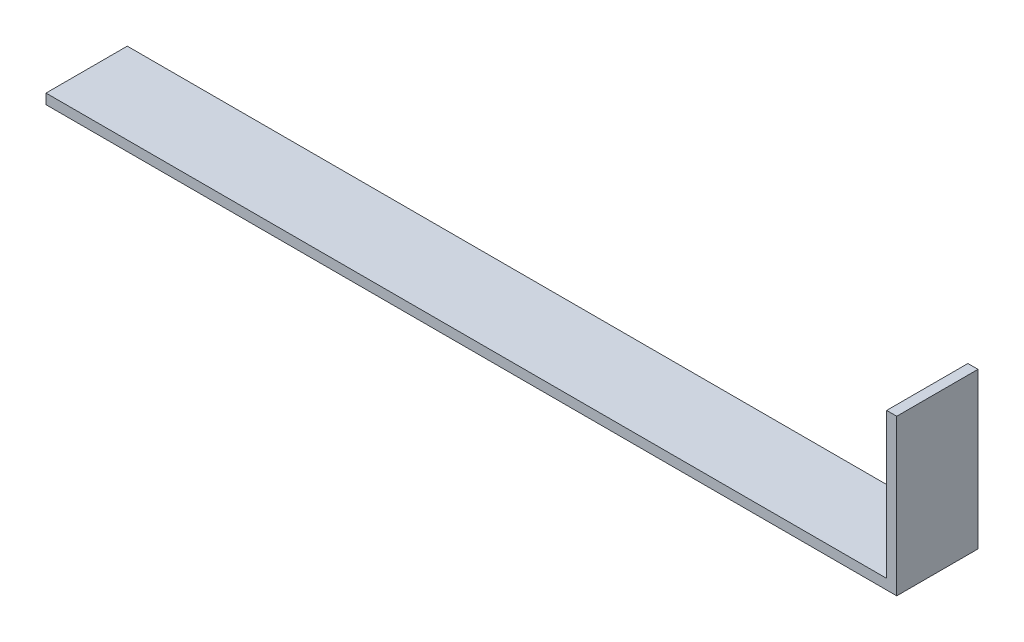
ISO-10303-21;
HEADER;
FILE_DESCRIPTION(('STEP AP214'),'2;1');
FILE_NAME('part.step','',(''),(''),'','','');
FILE_SCHEMA(('AUTOMOTIVE_DESIGN { 1 0 10303 214 1 1 1 1 }'));
ENDSEC;
DATA;
#1=APPLICATION_CONTEXT('core data for automotive mechanical design processes');
#2=APPLICATION_PROTOCOL_DEFINITION('international standard','automotive_design',2000,#1);
#3=PRODUCT_CONTEXT('',#1,'mechanical');
#4=PRODUCT('Part','Part','',(#3));
#5=PRODUCT_RELATED_PRODUCT_CATEGORY('part','',(#4));
#6=PRODUCT_DEFINITION_FORMATION('','',#4);
#7=PRODUCT_DEFINITION_CONTEXT('part definition',#1,'design');
#8=PRODUCT_DEFINITION('design','',#6,#7);
#9=PRODUCT_DEFINITION_SHAPE('','',#8);
#10=(LENGTH_UNIT() NAMED_UNIT(*) SI_UNIT(.MILLI.,.METRE.));
#11=(NAMED_UNIT(*) PLANE_ANGLE_UNIT() SI_UNIT($,.RADIAN.));
#12=(NAMED_UNIT(*) SI_UNIT($,.STERADIAN.) SOLID_ANGLE_UNIT());
#13=UNCERTAINTY_MEASURE_WITH_UNIT(LENGTH_MEASURE(1.E-05),#10,'distance_accuracy_value','');
#14=(GEOMETRIC_REPRESENTATION_CONTEXT(3) GLOBAL_UNCERTAINTY_ASSIGNED_CONTEXT((#13)) GLOBAL_UNIT_ASSIGNED_CONTEXT((#10,
#11,#12)) REPRESENTATION_CONTEXT('',''));
#15=CARTESIAN_POINT('',(0.,0.,0.));
#16=DIRECTION('',(0.,0.,1.));
#17=DIRECTION('',(1.,0.,0.));
#18=AXIS2_PLACEMENT_3D('',#15,#16,#17);
#19=CARTESIAN_POINT('',(0.,-6.31,50.8));
#20=DIRECTION('',(0.,1.,0.));
#21=DIRECTION('',(0.,0.,1.));
#22=AXIS2_PLACEMENT_3D('',#19,#20,#21);
#23=PLANE('',#22);
#24=DIRECTION('',(1.,0.,0.));
#25=VECTOR('',#24,1.);
#26=CARTESIAN_POINT('',(0.,-6.31,0.));
#27=LINE('',#26,#25);
#28=CARTESIAN_POINT('',(-322.45,-6.31,0.));
#29=VERTEX_POINT('',#28);
#30=CARTESIAN_POINT('',(209.247647511231,-6.31,0.));
#31=VERTEX_POINT('',#30);
#32=EDGE_CURVE('E96',#29,#31,#27,.T.);
#33=ORIENTED_EDGE('',*,*,#32,.T.);
#34=DIRECTION('',(0.,0.,-1.));
#35=VECTOR('',#34,1.);
#36=CARTESIAN_POINT('',(209.247647511231,-6.31,50.8));
#37=LINE('',#36,#35);
#38=CARTESIAN_POINT('',(209.247647511231,-6.31,50.8));
#39=VERTEX_POINT('',#38);
#40=EDGE_CURVE('E11',#39,#31,#37,.T.);
#41=ORIENTED_EDGE('',*,*,#40,.F.);
#42=DIRECTION('',(1.,0.,0.));
#43=VECTOR('',#42,1.);
#44=CARTESIAN_POINT('',(0.,-6.31,50.8));
#45=LINE('',#44,#43);
#46=CARTESIAN_POINT('',(-322.45,-6.31,50.8));
#47=VERTEX_POINT('',#46);
#48=EDGE_CURVE('E77',#47,#39,#45,.T.);
#49=ORIENTED_EDGE('',*,*,#48,.F.);
#50=DIRECTION('',(0.,0.,1.));
#51=VECTOR('',#50,1.);
#52=CARTESIAN_POINT('',(-322.45,-6.31,50.8));
#53=LINE('',#52,#51);
#54=EDGE_CURVE('E107',#29,#47,#53,.T.);
#55=ORIENTED_EDGE('',*,*,#54,.F.);
#56=EDGE_LOOP('',(#33,#41,#49,#55));
#57=FACE_BOUND('',#56,.T.);
#58=ADVANCED_FACE('F35',(#57),#23,.F.);
#59=CARTESIAN_POINT('',(209.247647511231,-6.31,50.8));
#60=DIRECTION('',(-1.,0.,0.));
#61=DIRECTION('',(0.,0.,1.));
#62=AXIS2_PLACEMENT_3D('',#59,#60,#61);
#63=PLANE('',#62);
#64=DIRECTION('',(0.,1.,0.));
#65=VECTOR('',#64,1.);
#66=CARTESIAN_POINT('',(209.247647511231,-6.31,0.));
#67=LINE('',#66,#65);
#68=CARTESIAN_POINT('',(209.247647511231,90.92,0.));
#69=VERTEX_POINT('',#68);
#70=EDGE_CURVE('E102',#31,#69,#67,.T.);
#71=ORIENTED_EDGE('',*,*,#70,.T.);
#72=DIRECTION('',(0.,0.,-1.));
#73=VECTOR('',#72,1.);
#74=CARTESIAN_POINT('',(209.247647511231,90.92,0.));
#75=LINE('',#74,#73);
#76=CARTESIAN_POINT('',(209.247647511231,90.92,50.8));
#77=VERTEX_POINT('',#76);
#78=EDGE_CURVE('E104',#77,#69,#75,.T.);
#79=ORIENTED_EDGE('',*,*,#78,.F.);
#80=DIRECTION('',(0.,1.,0.));
#81=VECTOR('',#80,1.);
#82=CARTESIAN_POINT('',(209.247647511231,-6.31,50.8));
#83=LINE('',#82,#81);
#84=EDGE_CURVE('E122',#39,#77,#83,.T.);
#85=ORIENTED_EDGE('',*,*,#84,.F.);
#86=ORIENTED_EDGE('',*,*,#40,.T.);
#87=EDGE_LOOP('',(#71,#79,#85,#86));
#88=FACE_BOUND('',#87,.T.);
#89=ADVANCED_FACE('F153',(#88),#63,.F.);
#90=CARTESIAN_POINT('',(202.93764751123,90.92,50.8));
#91=DIRECTION('',(0.,-1.,0.));
#92=DIRECTION('',(0.,0.,-1.));
#93=AXIS2_PLACEMENT_3D('',#90,#91,#92);
#94=PLANE('',#93);
#95=DIRECTION('',(-1.,0.,0.));
#96=VECTOR('',#95,1.);
#97=CARTESIAN_POINT('',(202.93764751123,90.92,50.8));
#98=LINE('',#97,#96);
#99=CARTESIAN_POINT('',(202.93764751123,90.92,50.8));
#100=VERTEX_POINT('',#99);
#101=EDGE_CURVE('E125',#77,#100,#98,.T.);
#102=ORIENTED_EDGE('',*,*,#101,.F.);
#103=ORIENTED_EDGE('',*,*,#78,.T.);
#104=DIRECTION('',(-1.,0.,0.));
#105=VECTOR('',#104,1.);
#106=CARTESIAN_POINT('',(202.93764751123,90.92,0.));
#107=LINE('',#106,#105);
#108=CARTESIAN_POINT('',(202.93764751123,90.92,0.));
#109=VERTEX_POINT('',#108);
#110=EDGE_CURVE('E66',#69,#109,#107,.T.);
#111=ORIENTED_EDGE('',*,*,#110,.T.);
#112=DIRECTION('',(0.,0.,-1.));
#113=VECTOR('',#112,1.);
#114=CARTESIAN_POINT('',(202.93764751123,90.92,50.8));
#115=LINE('',#114,#113);
#116=EDGE_CURVE('E43',#100,#109,#115,.T.);
#117=ORIENTED_EDGE('',*,*,#116,.F.);
#118=EDGE_LOOP('',(#102,#103,#111,#117));
#119=FACE_BOUND('',#118,.T.);
#120=ADVANCED_FACE('F157',(#119),#94,.F.);
#121=CARTESIAN_POINT('',(202.93764751123,0.,50.8));
#122=DIRECTION('',(1.,0.,0.));
#123=DIRECTION('',(0.,0.,-1.));
#124=AXIS2_PLACEMENT_3D('',#121,#122,#123);
#125=PLANE('',#124);
#126=DIRECTION('',(0.,-1.,0.));
#127=VECTOR('',#126,1.);
#128=CARTESIAN_POINT('',(202.93764751123,0.,0.));
#129=LINE('',#128,#127);
#130=CARTESIAN_POINT('',(202.93764751123,0.,0.));
#131=VERTEX_POINT('',#130);
#132=EDGE_CURVE('E71',#109,#131,#129,.T.);
#133=ORIENTED_EDGE('',*,*,#132,.T.);
#134=DIRECTION('',(0.,0.,-1.));
#135=VECTOR('',#134,1.);
#136=CARTESIAN_POINT('',(202.93764751123,0.,50.8));
#137=LINE('',#136,#135);
#138=CARTESIAN_POINT('',(202.93764751123,0.,50.8));
#139=VERTEX_POINT('',#138);
#140=EDGE_CURVE('E129',#139,#131,#137,.T.);
#141=ORIENTED_EDGE('',*,*,#140,.F.);
#142=DIRECTION('',(0.,-1.,0.));
#143=VECTOR('',#142,1.);
#144=CARTESIAN_POINT('',(202.93764751123,0.,50.8));
#145=LINE('',#144,#143);
#146=EDGE_CURVE('E51',#100,#139,#145,.T.);
#147=ORIENTED_EDGE('',*,*,#146,.F.);
#148=ORIENTED_EDGE('',*,*,#116,.T.);
#149=EDGE_LOOP('',(#133,#141,#147,#148));
#150=FACE_BOUND('',#149,.T.);
#151=ADVANCED_FACE('F135',(#150),#125,.F.);
#152=CARTESIAN_POINT('',(0.,0.,50.8));
#153=DIRECTION('',(0.,-1.,0.));
#154=DIRECTION('',(0.,0.,-1.));
#155=AXIS2_PLACEMENT_3D('',#152,#153,#154);
#156=PLANE('',#155);
#157=DIRECTION('',(-1.,0.,0.));
#158=VECTOR('',#157,1.);
#159=CARTESIAN_POINT('',(0.,0.,0.));
#160=LINE('',#159,#158);
#161=CARTESIAN_POINT('',(-322.45,0.,0.));
#162=VERTEX_POINT('',#161);
#163=EDGE_CURVE('E123',#131,#162,#160,.T.);
#164=ORIENTED_EDGE('',*,*,#163,.T.);
#165=DIRECTION('',(0.,0.,-1.));
#166=VECTOR('',#165,1.);
#167=CARTESIAN_POINT('',(-322.45,0.,0.));
#168=LINE('',#167,#166);
#169=CARTESIAN_POINT('',(-322.45,0.,50.8));
#170=VERTEX_POINT('',#169);
#171=EDGE_CURVE('E115',#170,#162,#168,.T.);
#172=ORIENTED_EDGE('',*,*,#171,.F.);
#173=DIRECTION('',(-1.,0.,0.));
#174=VECTOR('',#173,1.);
#175=CARTESIAN_POINT('',(0.,0.,50.8));
#176=LINE('',#175,#174);
#177=EDGE_CURVE('E128',#139,#170,#176,.T.);
#178=ORIENTED_EDGE('',*,*,#177,.F.);
#179=ORIENTED_EDGE('',*,*,#140,.T.);
#180=EDGE_LOOP('',(#164,#172,#178,#179));
#181=FACE_BOUND('',#180,.T.);
#182=ADVANCED_FACE('F138',(#181),#156,.F.);
#183=CARTESIAN_POINT('',(0.,0.,50.8));
#184=DIRECTION('',(0.,0.,1.));
#185=DIRECTION('',(1.,0.,0.));
#186=AXIS2_PLACEMENT_3D('',#183,#184,#185);
#187=PLANE('',#186);
#188=ORIENTED_EDGE('',*,*,#84,.T.);
#189=ORIENTED_EDGE('',*,*,#101,.T.);
#190=ORIENTED_EDGE('',*,*,#146,.T.);
#191=ORIENTED_EDGE('',*,*,#177,.T.);
#192=DIRECTION('',(0.,1.,0.));
#193=VECTOR('',#192,1.);
#194=CARTESIAN_POINT('',(-322.45,0.,50.8));
#195=LINE('',#194,#193);
#196=EDGE_CURVE('E110',#47,#170,#195,.T.);
#197=ORIENTED_EDGE('',*,*,#196,.F.);
#198=ORIENTED_EDGE('',*,*,#48,.T.);
#199=EDGE_LOOP('',(#188,#189,#190,#191,#197,#198));
#200=FACE_BOUND('',#199,.T.);
#201=ADVANCED_FACE('F140',(#200),#187,.T.);
#202=CARTESIAN_POINT('',(0.,0.,0.));
#203=DIRECTION('',(0.,0.,1.));
#204=DIRECTION('',(1.,0.,0.));
#205=AXIS2_PLACEMENT_3D('',#202,#203,#204);
#206=PLANE('',#205);
#207=ORIENTED_EDGE('',*,*,#110,.F.);
#208=ORIENTED_EDGE('',*,*,#70,.F.);
#209=ORIENTED_EDGE('',*,*,#32,.F.);
#210=DIRECTION('',(0.,-1.,0.));
#211=VECTOR('',#210,1.);
#212=CARTESIAN_POINT('',(-322.45,-6.31,0.));
#213=LINE('',#212,#211);
#214=EDGE_CURVE('E101',#162,#29,#213,.T.);
#215=ORIENTED_EDGE('',*,*,#214,.F.);
#216=ORIENTED_EDGE('',*,*,#163,.F.);
#217=ORIENTED_EDGE('',*,*,#132,.F.);
#218=EDGE_LOOP('',(#207,#208,#209,#215,#216,#217));
#219=FACE_BOUND('',#218,.T.);
#220=ADVANCED_FACE('F98',(#219),#206,.F.);
#221=CARTESIAN_POINT('',(-322.45,0.,0.));
#222=DIRECTION('',(1.,0.,0.));
#223=DIRECTION('',(0.,0.,-1.));
#224=AXIS2_PLACEMENT_3D('',#221,#222,#223);
#225=PLANE('',#224);
#226=ORIENTED_EDGE('',*,*,#214,.T.);
#227=ORIENTED_EDGE('',*,*,#54,.T.);
#228=ORIENTED_EDGE('',*,*,#196,.T.);
#229=ORIENTED_EDGE('',*,*,#171,.T.);
#230=EDGE_LOOP('',(#226,#227,#228,#229));
#231=FACE_BOUND('',#230,.T.);
#232=ADVANCED_FACE('F113',(#231),#225,.F.);
#233=CLOSED_SHELL('',(#58,#89,#120,#151,#182,#201,#220,#232));
#234=MANIFOLD_SOLID_BREP('B2',#233);
#235=ADVANCED_BREP_SHAPE_REPRESENTATION('',(#18,#234),#14);
#236=SHAPE_DEFINITION_REPRESENTATION(#9,#235);
ENDSEC;
END-ISO-10303-21;
